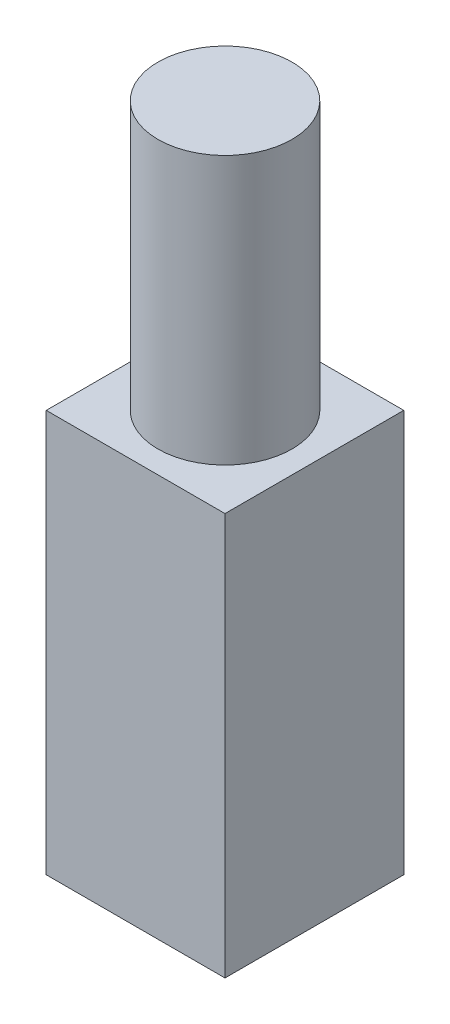
ISO-10303-21;
HEADER;
FILE_DESCRIPTION(('STEP AP214'),'2;1');
FILE_NAME('part.step','',(''),(''),'','','');
FILE_SCHEMA(('AUTOMOTIVE_DESIGN { 1 0 10303 214 1 1 1 1 }'));
ENDSEC;
DATA;
#1=APPLICATION_CONTEXT('core data for automotive mechanical design processes');
#2=APPLICATION_PROTOCOL_DEFINITION('international standard','automotive_design',2000,#1);
#3=PRODUCT_CONTEXT('',#1,'mechanical');
#4=PRODUCT('Part','Part','',(#3));
#5=PRODUCT_RELATED_PRODUCT_CATEGORY('part','',(#4));
#6=PRODUCT_DEFINITION_FORMATION('','',#4);
#7=PRODUCT_DEFINITION_CONTEXT('part definition',#1,'design');
#8=PRODUCT_DEFINITION('design','',#6,#7);
#9=PRODUCT_DEFINITION_SHAPE('','',#8);
#10=(LENGTH_UNIT() NAMED_UNIT(*) SI_UNIT(.MILLI.,.METRE.));
#11=(NAMED_UNIT(*) PLANE_ANGLE_UNIT() SI_UNIT($,.RADIAN.));
#12=(NAMED_UNIT(*) SI_UNIT($,.STERADIAN.) SOLID_ANGLE_UNIT());
#13=UNCERTAINTY_MEASURE_WITH_UNIT(LENGTH_MEASURE(1.E-05),#10,'distance_accuracy_value','');
#14=(GEOMETRIC_REPRESENTATION_CONTEXT(3) GLOBAL_UNCERTAINTY_ASSIGNED_CONTEXT((#13)) GLOBAL_UNIT_ASSIGNED_CONTEXT((#10,
#11,#12)) REPRESENTATION_CONTEXT('',''));
#15=CARTESIAN_POINT('',(0.,0.,0.));
#16=DIRECTION('',(0.,0.,1.));
#17=DIRECTION('',(1.,0.,0.));
#18=AXIS2_PLACEMENT_3D('',#15,#16,#17);
#19=CARTESIAN_POINT('',(0.,30.,0.));
#20=DIRECTION('',(0.,-1.,0.));
#21=DIRECTION('',(0.,0.,-1.));
#22=AXIS2_PLACEMENT_3D('',#19,#20,#21);
#23=CYLINDRICAL_SURFACE('',#22,7.5);
#24=CARTESIAN_POINT('',(0.,30.,0.));
#25=DIRECTION('',(0.,1.,0.));
#26=DIRECTION('',(0.,0.,1.));
#27=AXIS2_PLACEMENT_3D('',#24,#25,#26);
#28=CIRCLE('',#27,7.5);
#29=CARTESIAN_POINT('',(0.,30.,7.5));
#30=VERTEX_POINT('',#29);
#31=EDGE_CURVE('E11',#30,#30,#28,.T.);
#32=ORIENTED_EDGE('',*,*,#31,.F.);
#33=EDGE_LOOP('',(#32));
#34=FACE_BOUND('',#33,.T.);
#35=CARTESIAN_POINT('',(0.,0.,0.));
#36=DIRECTION('',(0.,1.,0.));
#37=DIRECTION('',(0.,0.,1.));
#38=AXIS2_PLACEMENT_3D('',#35,#36,#37);
#39=CIRCLE('',#38,7.5);
#40=CARTESIAN_POINT('',(0.,0.,7.5));
#41=VERTEX_POINT('',#40);
#42=EDGE_CURVE('E41',#41,#41,#39,.T.);
#43=ORIENTED_EDGE('',*,*,#42,.T.);
#44=EDGE_LOOP('',(#43));
#45=FACE_BOUND('',#44,.T.);
#46=ADVANCED_FACE('F33',(#34,#45),#23,.T.);
#47=CARTESIAN_POINT('',(0.,30.,0.));
#48=DIRECTION('',(0.,1.,0.));
#49=DIRECTION('',(0.,0.,1.));
#50=AXIS2_PLACEMENT_3D('',#47,#48,#49);
#51=PLANE('',#50);
#52=ORIENTED_EDGE('',*,*,#31,.T.);
#53=EDGE_LOOP('',(#52));
#54=FACE_BOUND('',#53,.T.);
#55=ADVANCED_FACE('F129',(#54),#51,.T.);
#56=CARTESIAN_POINT('',(-10.,-45.,10.));
#57=DIRECTION('',(1.,0.,0.));
#58=DIRECTION('',(0.,0.,-1.));
#59=AXIS2_PLACEMENT_3D('',#56,#57,#58);
#60=PLANE('',#59);
#61=DIRECTION('',(0.,0.,-1.));
#62=VECTOR('',#61,1.);
#63=CARTESIAN_POINT('',(-10.,0.,10.));
#64=LINE('',#63,#62);
#65=CARTESIAN_POINT('',(-10.,0.,10.));
#66=VERTEX_POINT('',#65);
#67=CARTESIAN_POINT('',(-10.,0.,-10.));
#68=VERTEX_POINT('',#67);
#69=EDGE_CURVE('E100',#66,#68,#64,.T.);
#70=ORIENTED_EDGE('',*,*,#69,.T.);
#71=DIRECTION('',(0.,1.,0.));
#72=VECTOR('',#71,1.);
#73=CARTESIAN_POINT('',(-10.,-45.,-10.));
#74=LINE('',#73,#72);
#75=CARTESIAN_POINT('',(-10.,-45.,-10.));
#76=VERTEX_POINT('',#75);
#77=EDGE_CURVE('E91',#76,#68,#74,.T.);
#78=ORIENTED_EDGE('',*,*,#77,.F.);
#79=DIRECTION('',(0.,0.,-1.));
#80=VECTOR('',#79,1.);
#81=CARTESIAN_POINT('',(-10.,-45.,10.));
#82=LINE('',#81,#80);
#83=CARTESIAN_POINT('',(-10.,-45.,10.));
#84=VERTEX_POINT('',#83);
#85=EDGE_CURVE('E85',#84,#76,#82,.T.);
#86=ORIENTED_EDGE('',*,*,#85,.F.);
#87=DIRECTION('',(0.,1.,0.));
#88=VECTOR('',#87,1.);
#89=CARTESIAN_POINT('',(-10.,-45.,10.));
#90=LINE('',#89,#88);
#91=EDGE_CURVE('E96',#84,#66,#90,.T.);
#92=ORIENTED_EDGE('',*,*,#91,.T.);
#93=EDGE_LOOP('',(#70,#78,#86,#92));
#94=FACE_BOUND('',#93,.T.);
#95=ADVANCED_FACE('F118',(#94),#60,.F.);
#96=CARTESIAN_POINT('',(10.,-45.,-10.));
#97=DIRECTION('',(0.,0.,1.));
#98=DIRECTION('',(1.,0.,0.));
#99=AXIS2_PLACEMENT_3D('',#96,#97,#98);
#100=PLANE('',#99);
#101=DIRECTION('',(1.,0.,0.));
#102=VECTOR('',#101,1.);
#103=CARTESIAN_POINT('',(10.,0.,-10.));
#104=LINE('',#103,#102);
#105=CARTESIAN_POINT('',(10.,0.,-10.));
#106=VERTEX_POINT('',#105);
#107=EDGE_CURVE('E90',#68,#106,#104,.T.);
#108=ORIENTED_EDGE('',*,*,#107,.T.);
#109=DIRECTION('',(0.,1.,0.));
#110=VECTOR('',#109,1.);
#111=CARTESIAN_POINT('',(10.,-45.,-10.));
#112=LINE('',#111,#110);
#113=CARTESIAN_POINT('',(10.,-45.,-10.));
#114=VERTEX_POINT('',#113);
#115=EDGE_CURVE('E88',#114,#106,#112,.T.);
#116=ORIENTED_EDGE('',*,*,#115,.F.);
#117=DIRECTION('',(1.,0.,0.));
#118=VECTOR('',#117,1.);
#119=CARTESIAN_POINT('',(10.,-45.,-10.));
#120=LINE('',#119,#118);
#121=EDGE_CURVE('E80',#76,#114,#120,.T.);
#122=ORIENTED_EDGE('',*,*,#121,.F.);
#123=ORIENTED_EDGE('',*,*,#77,.T.);
#124=EDGE_LOOP('',(#108,#116,#122,#123));
#125=FACE_BOUND('',#124,.T.);
#126=ADVANCED_FACE('F89',(#125),#100,.F.);
#127=CARTESIAN_POINT('',(10.,-45.,10.));
#128=DIRECTION('',(-1.,0.,0.));
#129=DIRECTION('',(0.,0.,1.));
#130=AXIS2_PLACEMENT_3D('',#127,#128,#129);
#131=PLANE('',#130);
#132=DIRECTION('',(0.,0.,1.));
#133=VECTOR('',#132,1.);
#134=CARTESIAN_POINT('',(10.,0.,10.));
#135=LINE('',#134,#133);
#136=CARTESIAN_POINT('',(10.,0.,10.));
#137=VERTEX_POINT('',#136);
#138=EDGE_CURVE('E66',#106,#137,#135,.T.);
#139=ORIENTED_EDGE('',*,*,#138,.T.);
#140=DIRECTION('',(0.,1.,0.));
#141=VECTOR('',#140,1.);
#142=CARTESIAN_POINT('',(10.,-45.,10.));
#143=LINE('',#142,#141);
#144=CARTESIAN_POINT('',(10.,-45.,10.));
#145=VERTEX_POINT('',#144);
#146=EDGE_CURVE('E92',#145,#137,#143,.T.);
#147=ORIENTED_EDGE('',*,*,#146,.F.);
#148=DIRECTION('',(0.,0.,1.));
#149=VECTOR('',#148,1.);
#150=CARTESIAN_POINT('',(10.,-45.,10.));
#151=LINE('',#150,#149);
#152=EDGE_CURVE('E83',#114,#145,#151,.T.);
#153=ORIENTED_EDGE('',*,*,#152,.F.);
#154=ORIENTED_EDGE('',*,*,#115,.T.);
#155=EDGE_LOOP('',(#139,#147,#153,#154));
#156=FACE_BOUND('',#155,.T.);
#157=ADVANCED_FACE('F94',(#156),#131,.F.);
#158=CARTESIAN_POINT('',(10.,-45.,10.));
#159=DIRECTION('',(0.,0.,-1.));
#160=DIRECTION('',(-1.,0.,0.));
#161=AXIS2_PLACEMENT_3D('',#158,#159,#160);
#162=PLANE('',#161);
#163=DIRECTION('',(-1.,0.,0.));
#164=VECTOR('',#163,1.);
#165=CARTESIAN_POINT('',(10.,0.,10.));
#166=LINE('',#165,#164);
#167=EDGE_CURVE('E72',#137,#66,#166,.T.);
#168=ORIENTED_EDGE('',*,*,#167,.T.);
#169=ORIENTED_EDGE('',*,*,#91,.F.);
#170=DIRECTION('',(-1.,0.,0.));
#171=VECTOR('',#170,1.);
#172=CARTESIAN_POINT('',(10.,-45.,10.));
#173=LINE('',#172,#171);
#174=EDGE_CURVE('E49',#145,#84,#173,.T.);
#175=ORIENTED_EDGE('',*,*,#174,.F.);
#176=ORIENTED_EDGE('',*,*,#146,.T.);
#177=EDGE_LOOP('',(#168,#169,#175,#176));
#178=FACE_BOUND('',#177,.T.);
#179=ADVANCED_FACE('F119',(#178),#162,.F.);
#180=CARTESIAN_POINT('',(0.,-45.,0.));
#181=DIRECTION('',(0.,1.,0.));
#182=DIRECTION('',(0.,0.,1.));
#183=AXIS2_PLACEMENT_3D('',#180,#181,#182);
#184=PLANE('',#183);
#185=ORIENTED_EDGE('',*,*,#85,.T.);
#186=ORIENTED_EDGE('',*,*,#121,.T.);
#187=ORIENTED_EDGE('',*,*,#152,.T.);
#188=ORIENTED_EDGE('',*,*,#174,.T.);
#189=EDGE_LOOP('',(#185,#186,#187,#188));
#190=FACE_BOUND('',#189,.T.);
#191=ADVANCED_FACE('F81',(#190),#184,.F.);
#192=CARTESIAN_POINT('',(0.,0.,0.));
#193=DIRECTION('',(0.,1.,0.));
#194=DIRECTION('',(0.,0.,1.));
#195=AXIS2_PLACEMENT_3D('',#192,#193,#194);
#196=PLANE('',#195);
#197=ORIENTED_EDGE('',*,*,#42,.F.);
#198=EDGE_LOOP('',(#197));
#199=FACE_BOUND('',#198,.T.);
#200=ORIENTED_EDGE('',*,*,#69,.F.);
#201=ORIENTED_EDGE('',*,*,#167,.F.);
#202=ORIENTED_EDGE('',*,*,#138,.F.);
#203=ORIENTED_EDGE('',*,*,#107,.F.);
#204=EDGE_LOOP('',(#200,#201,#202,#203));
#205=FACE_BOUND('',#204,.T.);
#206=ADVANCED_FACE('F112',(#199,#205),#196,.T.);
#207=CLOSED_SHELL('',(#46,#55,#95,#126,#157,#179,#191,#206));
#208=MANIFOLD_SOLID_BREP('B2',#207);
#209=ADVANCED_BREP_SHAPE_REPRESENTATION('',(#18,#208),#14);
#210=SHAPE_DEFINITION_REPRESENTATION(#9,#209);
ENDSEC;
END-ISO-10303-21;
